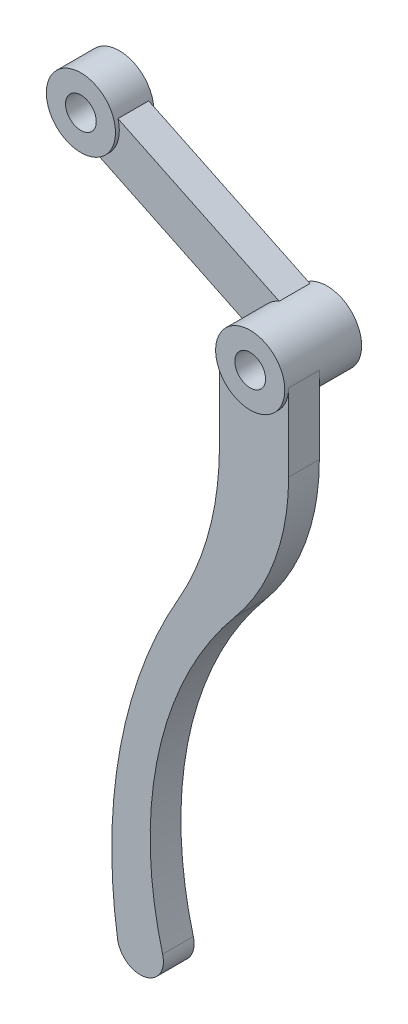
ISO-10303-21;
HEADER;
FILE_DESCRIPTION(('STEP AP214'),'2;1');
FILE_NAME('part.step','',(''),(''),'','','');
FILE_SCHEMA(('AUTOMOTIVE_DESIGN { 1 0 10303 214 1 1 1 1 }'));
ENDSEC;
DATA;
#1=APPLICATION_CONTEXT('core data for automotive mechanical design processes');
#2=APPLICATION_PROTOCOL_DEFINITION('international standard','automotive_design',2000,#1);
#3=PRODUCT_CONTEXT('',#1,'mechanical');
#4=PRODUCT('Part','Part','',(#3));
#5=PRODUCT_RELATED_PRODUCT_CATEGORY('part','',(#4));
#6=PRODUCT_DEFINITION_FORMATION('','',#4);
#7=PRODUCT_DEFINITION_CONTEXT('part definition',#1,'design');
#8=PRODUCT_DEFINITION('design','',#6,#7);
#9=PRODUCT_DEFINITION_SHAPE('','',#8);
#10=(LENGTH_UNIT() NAMED_UNIT(*) SI_UNIT(.MILLI.,.METRE.));
#11=(NAMED_UNIT(*) PLANE_ANGLE_UNIT() SI_UNIT($,.RADIAN.));
#12=(NAMED_UNIT(*) SI_UNIT($,.STERADIAN.) SOLID_ANGLE_UNIT());
#13=UNCERTAINTY_MEASURE_WITH_UNIT(LENGTH_MEASURE(1.E-05),#10,'distance_accuracy_value','');
#14=(GEOMETRIC_REPRESENTATION_CONTEXT(3) GLOBAL_UNCERTAINTY_ASSIGNED_CONTEXT((#13)) GLOBAL_UNIT_ASSIGNED_CONTEXT((#10,
#11,#12)) REPRESENTATION_CONTEXT('',''));
#15=CARTESIAN_POINT('',(0.,0.,0.));
#16=DIRECTION('',(0.,0.,1.));
#17=DIRECTION('',(1.,0.,0.));
#18=AXIS2_PLACEMENT_3D('',#15,#16,#17);
#19=CARTESIAN_POINT('',(0.,0.,10.));
#20=DIRECTION('',(0.,0.,-1.));
#21=DIRECTION('',(-1.,0.,0.));
#22=AXIS2_PLACEMENT_3D('',#19,#20,#21);
#23=CYLINDRICAL_SURFACE('',#22,9.);
#24=DIRECTION('',(0.,0.,-1.));
#25=VECTOR('',#24,1.);
#26=CARTESIAN_POINT('',(-9.,0.,19.));
#27=LINE('',#26,#25);
#28=CARTESIAN_POINT('',(-9.,0.,19.));
#29=VERTEX_POINT('',#28);
#30=CARTESIAN_POINT('',(-9.,0.,11.));
#31=VERTEX_POINT('',#30);
#32=EDGE_CURVE('E54',#29,#31,#27,.T.);
#33=ORIENTED_EDGE('',*,*,#32,.F.);
#34=CARTESIAN_POINT('',(0.,0.,19.));
#35=DIRECTION('',(0.,0.,-1.));
#36=DIRECTION('',(1.,0.,0.));
#37=AXIS2_PLACEMENT_3D('',#34,#35,#36);
#38=CIRCLE('',#37,9.);
#39=CARTESIAN_POINT('',(9.,0.,19.));
#40=VERTEX_POINT('',#39);
#41=EDGE_CURVE('E59',#40,#29,#38,.T.);
#42=ORIENTED_EDGE('',*,*,#41,.F.);
#43=DIRECTION('',(0.,0.,-1.));
#44=VECTOR('',#43,1.);
#45=CARTESIAN_POINT('',(9.,0.,19.));
#46=LINE('',#45,#44);
#47=CARTESIAN_POINT('',(9.,0.,11.));
#48=VERTEX_POINT('',#47);
#49=EDGE_CURVE('E166',#40,#48,#46,.T.);
#50=ORIENTED_EDGE('',*,*,#49,.T.);
#51=CARTESIAN_POINT('',(0.,0.,11.));
#52=DIRECTION('',(0.,0.,-1.));
#53=DIRECTION('',(1.,0.,0.));
#54=AXIS2_PLACEMENT_3D('',#51,#52,#53);
#55=CIRCLE('',#54,9.);
#56=EDGE_CURVE('E167',#48,#31,#55,.T.);
#57=ORIENTED_EDGE('',*,*,#56,.T.);
#58=EDGE_LOOP('',(#33,#42,#50,#57));
#59=FACE_BOUND('',#58,.T.);
#60=CARTESIAN_POINT('',(0.,0.,0.));
#61=DIRECTION('',(0.,0.,1.));
#62=DIRECTION('',(1.,0.,0.));
#63=AXIS2_PLACEMENT_3D('',#60,#61,#62);
#64=CIRCLE('',#63,9.);
#65=CARTESIAN_POINT('',(9.,0.,0.));
#66=VERTEX_POINT('',#65);
#67=EDGE_CURVE('E11',#66,#66,#64,.T.);
#68=ORIENTED_EDGE('',*,*,#67,.T.);
#69=EDGE_LOOP('',(#68));
#70=FACE_BOUND('',#69,.T.);
#71=CARTESIAN_POINT('',(0.,0.,1.));
#72=DIRECTION('',(0.,0.,-1.));
#73=DIRECTION('',(1.,0.,0.));
#74=AXIS2_PLACEMENT_3D('',#71,#72,#73);
#75=CIRCLE('',#74,9.);
#76=CARTESIAN_POINT('',(-8.64550313801937,-2.50105487554696,1.));
#77=VERTEX_POINT('',#76);
#78=CARTESIAN_POINT('',(-3.44617977852671,8.31407510996103,1.));
#79=VERTEX_POINT('',#78);
#80=EDGE_CURVE('E238',#77,#79,#75,.T.);
#81=ORIENTED_EDGE('',*,*,#80,.T.);
#82=DIRECTION('',(0.,0.,1.));
#83=VECTOR('',#82,1.);
#84=CARTESIAN_POINT('',(-3.44617977852671,8.31407510996103,1.));
#85=LINE('',#84,#83);
#86=CARTESIAN_POINT('',(-3.44617977852671,8.31407510996103,9.));
#87=VERTEX_POINT('',#86);
#88=EDGE_CURVE('E254',#79,#87,#85,.T.);
#89=ORIENTED_EDGE('',*,*,#88,.T.);
#90=CARTESIAN_POINT('',(0.,0.,9.));
#91=DIRECTION('',(0.,0.,-1.));
#92=DIRECTION('',(1.,0.,0.));
#93=AXIS2_PLACEMENT_3D('',#90,#91,#92);
#94=CIRCLE('',#93,9.);
#95=CARTESIAN_POINT('',(-8.64550313801937,-2.50105487554696,9.));
#96=VERTEX_POINT('',#95);
#97=EDGE_CURVE('E234',#96,#87,#94,.T.);
#98=ORIENTED_EDGE('',*,*,#97,.F.);
#99=DIRECTION('',(0.,0.,1.));
#100=VECTOR('',#99,1.);
#101=CARTESIAN_POINT('',(-8.64550313801937,-2.50105487554696,1.));
#102=LINE('',#101,#100);
#103=EDGE_CURVE('E268',#77,#96,#102,.T.);
#104=ORIENTED_EDGE('',*,*,#103,.F.);
#105=EDGE_LOOP('',(#81,#89,#98,#104));
#106=FACE_BOUND('',#105,.T.);
#107=CARTESIAN_POINT('',(0.,0.,20.));
#108=DIRECTION('',(0.,0.,1.));
#109=DIRECTION('',(1.,0.,0.));
#110=AXIS2_PLACEMENT_3D('',#107,#108,#109);
#111=CIRCLE('',#110,9.);
#112=CARTESIAN_POINT('',(9.,0.,20.));
#113=VERTEX_POINT('',#112);
#114=EDGE_CURVE('E217',#113,#113,#111,.T.);
#115=ORIENTED_EDGE('',*,*,#114,.F.);
#116=EDGE_LOOP('',(#115));
#117=FACE_BOUND('',#116,.T.);
#118=ADVANCED_FACE('F39',(#59,#70,#106,#117),#23,.T.);
#119=CARTESIAN_POINT('',(0.,0.,0.));
#120=DIRECTION('',(0.,0.,1.));
#121=DIRECTION('',(1.,0.,0.));
#122=AXIS2_PLACEMENT_3D('',#119,#120,#121);
#123=PLANE('',#122);
#124=ORIENTED_EDGE('',*,*,#67,.F.);
#125=EDGE_LOOP('',(#124));
#126=FACE_BOUND('',#125,.T.);
#127=CARTESIAN_POINT('',(0.,0.,0.));
#128=DIRECTION('',(0.,0.,1.));
#129=DIRECTION('',(1.,0.,0.));
#130=AXIS2_PLACEMENT_3D('',#127,#128,#129);
#131=CIRCLE('',#130,4.);
#132=CARTESIAN_POINT('',(4.,0.,0.));
#133=VERTEX_POINT('',#132);
#134=EDGE_CURVE('E47',#133,#133,#131,.T.);
#135=ORIENTED_EDGE('',*,*,#134,.T.);
#136=EDGE_LOOP('',(#135));
#137=FACE_BOUND('',#136,.T.);
#138=ADVANCED_FACE('F285',(#126,#137),#123,.F.);
#139=CARTESIAN_POINT('',(0.,0.,10.));
#140=DIRECTION('',(0.,0.,-1.));
#141=DIRECTION('',(-1.,0.,0.));
#142=AXIS2_PLACEMENT_3D('',#139,#140,#141);
#143=CYLINDRICAL_SURFACE('',#142,4.);
#144=ORIENTED_EDGE('',*,*,#134,.F.);
#145=EDGE_LOOP('',(#144));
#146=FACE_BOUND('',#145,.T.);
#147=CARTESIAN_POINT('',(0.,0.,20.));
#148=DIRECTION('',(0.,0.,1.));
#149=DIRECTION('',(1.,0.,0.));
#150=AXIS2_PLACEMENT_3D('',#147,#148,#149);
#151=CIRCLE('',#150,4.);
#152=CARTESIAN_POINT('',(4.,0.,20.));
#153=VERTEX_POINT('',#152);
#154=EDGE_CURVE('E213',#153,#153,#151,.T.);
#155=ORIENTED_EDGE('',*,*,#154,.T.);
#156=EDGE_LOOP('',(#155));
#157=FACE_BOUND('',#156,.T.);
#158=ADVANCED_FACE('F287',(#146,#157),#143,.F.);
#159=CARTESIAN_POINT('',(-50.6294701490132,17.6825416875023,1.));
#160=DIRECTION('',(-0.433276946624388,-0.901260832125666,0.));
#161=DIRECTION('',(0.901260832125666,-0.433276946624388,0.));
#162=AXIS2_PLACEMENT_3D('',#159,#160,#161);
#163=PLANE('',#162);
#164=DIRECTION('',(0.901260832125665,-0.433276946624388,0.));
#165=VECTOR('',#164,1.);
#166=CARTESIAN_POINT('',(-50.6294701490132,17.6825416875023,9.));
#167=LINE('',#166,#165);
#168=CARTESIAN_POINT('',(-50.6294701490132,17.6825416875023,9.));
#169=VERTEX_POINT('',#168);
#170=EDGE_CURVE('E243',#169,#96,#167,.T.);
#171=ORIENTED_EDGE('',*,*,#170,.F.);
#172=DIRECTION('',(0.,0.,1.));
#173=VECTOR('',#172,1.);
#174=CARTESIAN_POINT('',(-50.6294701490132,17.6825416875023,1.));
#175=LINE('',#174,#173);
#176=CARTESIAN_POINT('',(-50.6294701490132,17.6825416875023,1.));
#177=VERTEX_POINT('',#176);
#178=EDGE_CURVE('E272',#177,#169,#175,.T.);
#179=ORIENTED_EDGE('',*,*,#178,.F.);
#180=DIRECTION('',(0.901260832125665,-0.433276946624388,0.));
#181=VECTOR('',#180,1.);
#182=CARTESIAN_POINT('',(-50.6294701490132,17.6825416875023,1.));
#183=LINE('',#182,#181);
#184=EDGE_CURVE('E250',#177,#77,#183,.T.);
#185=ORIENTED_EDGE('',*,*,#184,.T.);
#186=ORIENTED_EDGE('',*,*,#103,.T.);
#187=EDGE_LOOP('',(#171,#179,#185,#186));
#188=FACE_BOUND('',#187,.T.);
#189=ADVANCED_FACE('F290',(#188),#163,.T.);
#190=CARTESIAN_POINT('',(-45.4301467895205,28.4976716730102,1.));
#191=DIRECTION('',(0.433276946624388,0.901260832125665,0.));
#192=DIRECTION('',(-0.901260832125665,0.433276946624388,0.));
#193=AXIS2_PLACEMENT_3D('',#190,#191,#192);
#194=PLANE('',#193);
#195=DIRECTION('',(-0.901260832125665,0.433276946624388,0.));
#196=VECTOR('',#195,1.);
#197=CARTESIAN_POINT('',(-45.4301467895205,28.4976716730102,9.));
#198=LINE('',#197,#196);
#199=CARTESIAN_POINT('',(-45.4301467895205,28.4976716730102,9.));
#200=VERTEX_POINT('',#199);
#201=EDGE_CURVE('E258',#87,#200,#198,.T.);
#202=ORIENTED_EDGE('',*,*,#201,.F.);
#203=ORIENTED_EDGE('',*,*,#88,.F.);
#204=DIRECTION('',(-0.901260832125665,0.433276946624388,0.));
#205=VECTOR('',#204,1.);
#206=CARTESIAN_POINT('',(-45.4301467895205,28.4976716730102,1.));
#207=LINE('',#206,#205);
#208=CARTESIAN_POINT('',(-45.4301467895205,28.4976716730102,1.));
#209=VERTEX_POINT('',#208);
#210=EDGE_CURVE('E242',#79,#209,#207,.T.);
#211=ORIENTED_EDGE('',*,*,#210,.T.);
#212=DIRECTION('',(0.,0.,1.));
#213=VECTOR('',#212,1.);
#214=CARTESIAN_POINT('',(-45.4301467895205,28.4976716730102,1.));
#215=LINE('',#214,#213);
#216=EDGE_CURVE('E275',#209,#200,#215,.T.);
#217=ORIENTED_EDGE('',*,*,#216,.T.);
#218=EDGE_LOOP('',(#202,#203,#211,#217));
#219=FACE_BOUND('',#218,.T.);
#220=ADVANCED_FACE('F332',(#219),#194,.T.);
#221=CARTESIAN_POINT('',(0.,0.,1.));
#222=DIRECTION('',(0.,0.,1.));
#223=DIRECTION('',(1.,0.,0.));
#224=AXIS2_PLACEMENT_3D('',#221,#222,#223);
#225=PLANE('',#224);
#226=ORIENTED_EDGE('',*,*,#80,.F.);
#227=ORIENTED_EDGE('',*,*,#184,.F.);
#228=CARTESIAN_POINT('',(-54.0756499275399,25.9966167974633,1.));
#229=DIRECTION('',(0.,0.,-1.));
#230=DIRECTION('',(1.,0.,0.));
#231=AXIS2_PLACEMENT_3D('',#228,#229,#230);
#232=CIRCLE('',#231,9.00000000000001);
#233=EDGE_CURVE('E247',#209,#177,#232,.T.);
#234=ORIENTED_EDGE('',*,*,#233,.F.);
#235=ORIENTED_EDGE('',*,*,#210,.F.);
#236=EDGE_LOOP('',(#226,#227,#234,#235));
#237=FACE_BOUND('',#236,.T.);
#238=ADVANCED_FACE('F322',(#237),#225,.F.);
#239=CARTESIAN_POINT('',(0.,0.,9.));
#240=DIRECTION('',(0.,0.,1.));
#241=DIRECTION('',(1.,0.,0.));
#242=AXIS2_PLACEMENT_3D('',#239,#240,#241);
#243=PLANE('',#242);
#244=ORIENTED_EDGE('',*,*,#97,.T.);
#245=ORIENTED_EDGE('',*,*,#201,.T.);
#246=CARTESIAN_POINT('',(-54.0756499275399,25.9966167974633,9.));
#247=DIRECTION('',(0.,0.,-1.));
#248=DIRECTION('',(1.,0.,0.));
#249=AXIS2_PLACEMENT_3D('',#246,#247,#248);
#250=CIRCLE('',#249,9.00000000000001);
#251=EDGE_CURVE('E262',#200,#169,#250,.T.);
#252=ORIENTED_EDGE('',*,*,#251,.T.);
#253=ORIENTED_EDGE('',*,*,#170,.T.);
#254=EDGE_LOOP('',(#244,#245,#252,#253));
#255=FACE_BOUND('',#254,.T.);
#256=ADVANCED_FACE('F330',(#255),#243,.T.);
#257=CARTESIAN_POINT('',(-54.0756499275399,25.9966167974633,10.));
#258=DIRECTION('',(0.,0.,-1.));
#259=DIRECTION('',(-1.,0.,0.));
#260=AXIS2_PLACEMENT_3D('',#257,#258,#259);
#261=CYLINDRICAL_SURFACE('',#260,9.);
#262=CARTESIAN_POINT('',(-54.0756499275399,25.9966167974633,10.));
#263=DIRECTION('',(0.,0.,1.));
#264=DIRECTION('',(1.,0.,0.));
#265=AXIS2_PLACEMENT_3D('',#262,#263,#264);
#266=CIRCLE('',#265,9.);
#267=CARTESIAN_POINT('',(-45.0756499275399,25.9966167974633,10.));
#268=VERTEX_POINT('',#267);
#269=EDGE_CURVE('E230',#268,#268,#266,.T.);
#270=ORIENTED_EDGE('',*,*,#269,.F.);
#271=EDGE_LOOP('',(#270));
#272=FACE_BOUND('',#271,.T.);
#273=CARTESIAN_POINT('',(-54.0756499275399,25.9966167974633,0.));
#274=DIRECTION('',(0.,0.,1.));
#275=DIRECTION('',(1.,0.,0.));
#276=AXIS2_PLACEMENT_3D('',#273,#274,#275);
#277=CIRCLE('',#276,9.);
#278=CARTESIAN_POINT('',(-45.0756499275399,25.9966167974633,0.));
#279=VERTEX_POINT('',#278);
#280=EDGE_CURVE('E226',#279,#279,#277,.T.);
#281=ORIENTED_EDGE('',*,*,#280,.T.);
#282=EDGE_LOOP('',(#281));
#283=FACE_BOUND('',#282,.T.);
#284=ORIENTED_EDGE('',*,*,#216,.F.);
#285=ORIENTED_EDGE('',*,*,#233,.T.);
#286=ORIENTED_EDGE('',*,*,#178,.T.);
#287=ORIENTED_EDGE('',*,*,#251,.F.);
#288=EDGE_LOOP('',(#284,#285,#286,#287));
#289=FACE_BOUND('',#288,.T.);
#290=ADVANCED_FACE('F328',(#272,#283,#289),#261,.T.);
#291=CARTESIAN_POINT('',(-54.0756499275399,25.9966167974633,10.));
#292=DIRECTION('',(0.,0.,1.));
#293=DIRECTION('',(1.,0.,0.));
#294=AXIS2_PLACEMENT_3D('',#291,#292,#293);
#295=PLANE('',#294);
#296=ORIENTED_EDGE('',*,*,#269,.T.);
#297=EDGE_LOOP('',(#296));
#298=FACE_BOUND('',#297,.T.);
#299=CARTESIAN_POINT('',(-54.0756499275399,25.9966167974633,10.));
#300=DIRECTION('',(0.,0.,1.));
#301=DIRECTION('',(1.,0.,0.));
#302=AXIS2_PLACEMENT_3D('',#299,#300,#301);
#303=CIRCLE('',#302,4.);
#304=CARTESIAN_POINT('',(-50.0756499275399,25.9966167974633,10.));
#305=VERTEX_POINT('',#304);
#306=EDGE_CURVE('E222',#305,#305,#303,.T.);
#307=ORIENTED_EDGE('',*,*,#306,.F.);
#308=EDGE_LOOP('',(#307));
#309=FACE_BOUND('',#308,.T.);
#310=ADVANCED_FACE('F346',(#298,#309),#295,.T.);
#311=CARTESIAN_POINT('',(-54.0756499275399,25.9966167974633,0.));
#312=DIRECTION('',(0.,0.,1.));
#313=DIRECTION('',(1.,0.,0.));
#314=AXIS2_PLACEMENT_3D('',#311,#312,#313);
#315=PLANE('',#314);
#316=ORIENTED_EDGE('',*,*,#280,.F.);
#317=EDGE_LOOP('',(#316));
#318=FACE_BOUND('',#317,.T.);
#319=CARTESIAN_POINT('',(-54.0756499275399,25.9966167974633,0.));
#320=DIRECTION('',(0.,0.,1.));
#321=DIRECTION('',(1.,0.,0.));
#322=AXIS2_PLACEMENT_3D('',#319,#320,#321);
#323=CIRCLE('',#322,4.);
#324=CARTESIAN_POINT('',(-50.0756499275399,25.9966167974633,0.));
#325=VERTEX_POINT('',#324);
#326=EDGE_CURVE('E221',#325,#325,#323,.T.);
#327=ORIENTED_EDGE('',*,*,#326,.T.);
#328=EDGE_LOOP('',(#327));
#329=FACE_BOUND('',#328,.T.);
#330=ADVANCED_FACE('F304',(#318,#329),#315,.F.);
#331=CARTESIAN_POINT('',(-54.0756499275399,25.9966167974633,10.));
#332=DIRECTION('',(0.,0.,-1.));
#333=DIRECTION('',(-1.,0.,0.));
#334=AXIS2_PLACEMENT_3D('',#331,#332,#333);
#335=CYLINDRICAL_SURFACE('',#334,4.);
#336=ORIENTED_EDGE('',*,*,#306,.T.);
#337=EDGE_LOOP('',(#336));
#338=FACE_BOUND('',#337,.T.);
#339=ORIENTED_EDGE('',*,*,#326,.F.);
#340=EDGE_LOOP('',(#339));
#341=FACE_BOUND('',#340,.T.);
#342=ADVANCED_FACE('F296',(#338,#341),#335,.F.);
#343=CARTESIAN_POINT('',(0.,0.,20.));
#344=DIRECTION('',(0.,0.,1.));
#345=DIRECTION('',(1.,0.,0.));
#346=AXIS2_PLACEMENT_3D('',#343,#344,#345);
#347=PLANE('',#346);
#348=ORIENTED_EDGE('',*,*,#114,.T.);
#349=EDGE_LOOP('',(#348));
#350=FACE_BOUND('',#349,.T.);
#351=ORIENTED_EDGE('',*,*,#154,.F.);
#352=EDGE_LOOP('',(#351));
#353=FACE_BOUND('',#352,.T.);
#354=ADVANCED_FACE('F294',(#350,#353),#347,.T.);
#355=CARTESIAN_POINT('',(-9.,0.,19.));
#356=DIRECTION('',(1.,0.,0.));
#357=DIRECTION('',(0.,1.,0.));
#358=AXIS2_PLACEMENT_3D('',#355,#356,#357);
#359=PLANE('',#358);
#360=DIRECTION('',(0.,-1.,0.));
#361=VECTOR('',#360,1.);
#362=CARTESIAN_POINT('',(-9.,0.,11.));
#363=LINE('',#362,#361);
#364=CARTESIAN_POINT('',(-9.,-22.,11.));
#365=VERTEX_POINT('',#364);
#366=EDGE_CURVE('E138',#31,#365,#363,.T.);
#367=ORIENTED_EDGE('',*,*,#366,.T.);
#368=DIRECTION('',(0.,0.,-1.));
#369=VECTOR('',#368,1.);
#370=CARTESIAN_POINT('',(-9.,-22.,19.));
#371=LINE('',#370,#369);
#372=CARTESIAN_POINT('',(-9.,-22.,19.));
#373=VERTEX_POINT('',#372);
#374=EDGE_CURVE('E135',#373,#365,#371,.T.);
#375=ORIENTED_EDGE('',*,*,#374,.F.);
#376=DIRECTION('',(0.,-1.,0.));
#377=VECTOR('',#376,1.);
#378=CARTESIAN_POINT('',(-9.,0.,19.));
#379=LINE('',#378,#377);
#380=EDGE_CURVE('E125',#29,#373,#379,.T.);
#381=ORIENTED_EDGE('',*,*,#380,.F.);
#382=ORIENTED_EDGE('',*,*,#32,.T.);
#383=EDGE_LOOP('',(#367,#375,#381,#382));
#384=FACE_BOUND('',#383,.T.);
#385=ADVANCED_FACE('F136',(#384),#359,.F.);
#386=CARTESIAN_POINT('',(-89.,-22.,19.));
#387=DIRECTION('',(0.,0.,-1.));
#388=DIRECTION('',(-1.,0.,0.));
#389=AXIS2_PLACEMENT_3D('',#386,#387,#388);
#390=CYLINDRICAL_SURFACE('',#389,80.);
#391=CARTESIAN_POINT('',(-89.,-22.,11.));
#392=DIRECTION('',(0.,0.,-1.));
#393=DIRECTION('',(-1.,0.,0.));
#394=AXIS2_PLACEMENT_3D('',#391,#392,#393);
#395=CIRCLE('',#394,80.);
#396=CARTESIAN_POINT('',(-19.68061692844,-61.9352367036722,11.));
#397=VERTEX_POINT('',#396);
#398=EDGE_CURVE('E172',#365,#397,#395,.T.);
#399=ORIENTED_EDGE('',*,*,#398,.T.);
#400=DIRECTION('',(0.,0.,-1.));
#401=VECTOR('',#400,1.);
#402=CARTESIAN_POINT('',(-19.68061692844,-61.9352367036722,19.));
#403=LINE('',#402,#401);
#404=CARTESIAN_POINT('',(-19.68061692844,-61.9352367036722,19.));
#405=VERTEX_POINT('',#404);
#406=EDGE_CURVE('E142',#405,#397,#403,.T.);
#407=ORIENTED_EDGE('',*,*,#406,.F.);
#408=CARTESIAN_POINT('',(-89.,-22.,19.));
#409=DIRECTION('',(0.,0.,-1.));
#410=DIRECTION('',(-1.,0.,0.));
#411=AXIS2_PLACEMENT_3D('',#408,#409,#410);
#412=CIRCLE('',#411,80.);
#413=EDGE_CURVE('E129',#373,#405,#412,.T.);
#414=ORIENTED_EDGE('',*,*,#413,.F.);
#415=ORIENTED_EDGE('',*,*,#374,.T.);
#416=EDGE_LOOP('',(#399,#407,#414,#415));
#417=FACE_BOUND('',#416,.T.);
#418=ADVANCED_FACE('F144',(#417),#390,.F.);
#419=CARTESIAN_POINT('',(92.9633805628449,-126.829996347139,19.));
#420=DIRECTION('',(0.,0.,-1.));
#421=DIRECTION('',(-1.,0.,0.));
#422=AXIS2_PLACEMENT_3D('',#419,#420,#421);
#423=CYLINDRICAL_SURFACE('',#422,130.);
#424=CARTESIAN_POINT('',(92.9633805628449,-126.829996347139,11.));
#425=DIRECTION('',(0.,0.,1.));
#426=DIRECTION('',(1.,0.,0.));
#427=AXIS2_PLACEMENT_3D('',#424,#425,#426);
#428=CIRCLE('',#427,130.);
#429=CARTESIAN_POINT('',(-35.5320869407589,-146.550920033171,11.));
#430=VERTEX_POINT('',#429);
#431=EDGE_CURVE('E175',#397,#430,#428,.T.);
#432=ORIENTED_EDGE('',*,*,#431,.T.);
#433=DIRECTION('',(0.,0.,-1.));
#434=VECTOR('',#433,1.);
#435=CARTESIAN_POINT('',(-35.5320869407589,-146.550920033171,19.));
#436=LINE('',#435,#434);
#437=CARTESIAN_POINT('',(-35.5320869407589,-146.550920033171,19.));
#438=VERTEX_POINT('',#437);
#439=EDGE_CURVE('E205',#438,#430,#436,.T.);
#440=ORIENTED_EDGE('',*,*,#439,.F.);
#441=CARTESIAN_POINT('',(92.9633805628449,-126.829996347139,19.));
#442=DIRECTION('',(0.,0.,1.));
#443=DIRECTION('',(1.,0.,0.));
#444=AXIS2_PLACEMENT_3D('',#441,#442,#443);
#445=CIRCLE('',#444,130.);
#446=EDGE_CURVE('E148',#405,#438,#445,.T.);
#447=ORIENTED_EDGE('',*,*,#446,.F.);
#448=ORIENTED_EDGE('',*,*,#406,.T.);
#449=EDGE_LOOP('',(#432,#440,#447,#448));
#450=FACE_BOUND('',#449,.T.);
#451=ADVANCED_FACE('F407',(#450),#423,.T.);
#452=CARTESIAN_POINT('',(-29.601526902131,-145.640723555354,19.));
#453=DIRECTION('',(0.,0.,-1.));
#454=DIRECTION('',(-1.,0.,0.));
#455=AXIS2_PLACEMENT_3D('',#452,#453,#454);
#456=CYLINDRICAL_SURFACE('',#455,5.99999999999999);
#457=CARTESIAN_POINT('',(-29.601526902131,-145.640723555354,11.));
#458=DIRECTION('',(0.,0.,1.));
#459=DIRECTION('',(1.,0.,0.));
#460=AXIS2_PLACEMENT_3D('',#457,#458,#459);
#461=CIRCLE('',#460,5.99999999999999);
#462=CARTESIAN_POINT('',(-23.8059719443966,-144.087809284739,11.));
#463=VERTEX_POINT('',#462);
#464=EDGE_CURVE('E178',#430,#463,#461,.T.);
#465=ORIENTED_EDGE('',*,*,#464,.T.);
#466=DIRECTION('',(0.,0.,-1.));
#467=VECTOR('',#466,1.);
#468=CARTESIAN_POINT('',(-23.8059719443966,-144.087809284739,19.));
#469=LINE('',#468,#467);
#470=CARTESIAN_POINT('',(-23.8059719443966,-144.087809284739,19.));
#471=VERTEX_POINT('',#470);
#472=EDGE_CURVE('E201',#471,#463,#469,.T.);
#473=ORIENTED_EDGE('',*,*,#472,.F.);
#474=CARTESIAN_POINT('',(-29.601526902131,-145.640723555354,19.));
#475=DIRECTION('',(0.,0.,1.));
#476=DIRECTION('',(1.,0.,0.));
#477=AXIS2_PLACEMENT_3D('',#474,#475,#476);
#478=CIRCLE('',#477,5.99999999999999);
#479=EDGE_CURVE('E151',#438,#471,#478,.T.);
#480=ORIENTED_EDGE('',*,*,#479,.F.);
#481=ORIENTED_EDGE('',*,*,#439,.T.);
#482=EDGE_LOOP('',(#465,#473,#480,#481));
#483=FACE_BOUND('',#482,.T.);
#484=ADVANCED_FACE('F416',(#483),#456,.T.);
#485=CARTESIAN_POINT('',(67.956981553065,-119.5,19.));
#486=DIRECTION('',(0.,0.,-1.));
#487=DIRECTION('',(-1.,0.,0.));
#488=AXIS2_PLACEMENT_3D('',#485,#486,#487);
#489=CYLINDRICAL_SURFACE('',#488,95.);
#490=CARTESIAN_POINT('',(67.956981553065,-119.5,11.));
#491=DIRECTION('',(0.,0.,-1.));
#492=DIRECTION('',(-1.,0.,0.));
#493=AXIS2_PLACEMENT_3D('',#490,#491,#492);
#494=CIRCLE('',#493,95.);
#495=CARTESIAN_POINT('',(-4.95213617300708,-58.5963009957049,11.));
#496=VERTEX_POINT('',#495);
#497=EDGE_CURVE('E181',#463,#496,#494,.T.);
#498=ORIENTED_EDGE('',*,*,#497,.T.);
#499=DIRECTION('',(0.,0.,-1.));
#500=VECTOR('',#499,1.);
#501=CARTESIAN_POINT('',(-4.95213617300708,-58.5963009957049,19.));
#502=LINE('',#501,#500);
#503=CARTESIAN_POINT('',(-4.95213617300708,-58.5963009957049,19.));
#504=VERTEX_POINT('',#503);
#505=EDGE_CURVE('E197',#504,#496,#502,.T.);
#506=ORIENTED_EDGE('',*,*,#505,.F.);
#507=CARTESIAN_POINT('',(67.956981553065,-119.5,19.));
#508=DIRECTION('',(0.,0.,-1.));
#509=DIRECTION('',(-1.,0.,0.));
#510=AXIS2_PLACEMENT_3D('',#507,#508,#509);
#511=CIRCLE('',#510,95.);
#512=EDGE_CURVE('E157',#471,#504,#511,.T.);
#513=ORIENTED_EDGE('',*,*,#512,.F.);
#514=ORIENTED_EDGE('',*,*,#472,.T.);
#515=EDGE_LOOP('',(#498,#506,#513,#514));
#516=FACE_BOUND('',#515,.T.);
#517=ADVANCED_FACE('F426',(#516),#489,.F.);
#518=CARTESIAN_POINT('',(-51.,-20.1308068877292,19.));
#519=DIRECTION('',(0.,0.,-1.));
#520=DIRECTION('',(-1.,0.,0.));
#521=AXIS2_PLACEMENT_3D('',#518,#519,#520);
#522=CYLINDRICAL_SURFACE('',#521,60.);
#523=CARTESIAN_POINT('',(-51.,-20.1308068877292,11.));
#524=DIRECTION('',(0.,0.,1.));
#525=DIRECTION('',(1.,0.,0.));
#526=AXIS2_PLACEMENT_3D('',#523,#524,#525);
#527=CIRCLE('',#526,60.);
#528=CARTESIAN_POINT('',(9.,-20.1308068877292,11.));
#529=VERTEX_POINT('',#528);
#530=EDGE_CURVE('E184',#496,#529,#527,.T.);
#531=ORIENTED_EDGE('',*,*,#530,.T.);
#532=DIRECTION('',(0.,0.,-1.));
#533=VECTOR('',#532,1.);
#534=CARTESIAN_POINT('',(9.,-20.1308068877292,19.));
#535=LINE('',#534,#533);
#536=CARTESIAN_POINT('',(9.,-20.1308068877292,19.));
#537=VERTEX_POINT('',#536);
#538=EDGE_CURVE('E193',#537,#529,#535,.T.);
#539=ORIENTED_EDGE('',*,*,#538,.F.);
#540=CARTESIAN_POINT('',(-51.,-20.1308068877292,19.));
#541=DIRECTION('',(0.,0.,1.));
#542=DIRECTION('',(1.,0.,0.));
#543=AXIS2_PLACEMENT_3D('',#540,#541,#542);
#544=CIRCLE('',#543,60.);
#545=EDGE_CURVE('E160',#504,#537,#544,.T.);
#546=ORIENTED_EDGE('',*,*,#545,.F.);
#547=ORIENTED_EDGE('',*,*,#505,.T.);
#548=EDGE_LOOP('',(#531,#539,#546,#547));
#549=FACE_BOUND('',#548,.T.);
#550=ADVANCED_FACE('F436',(#549),#522,.T.);
#551=CARTESIAN_POINT('',(9.,0.,19.));
#552=DIRECTION('',(-1.,0.,0.));
#553=DIRECTION('',(0.,0.,1.));
#554=AXIS2_PLACEMENT_3D('',#551,#552,#553);
#555=PLANE('',#554);
#556=DIRECTION('',(0.,1.,0.));
#557=VECTOR('',#556,1.);
#558=CARTESIAN_POINT('',(9.,0.,11.));
#559=LINE('',#558,#557);
#560=EDGE_CURVE('E187',#529,#48,#559,.T.);
#561=ORIENTED_EDGE('',*,*,#560,.T.);
#562=ORIENTED_EDGE('',*,*,#49,.F.);
#563=DIRECTION('',(0.,1.,0.));
#564=VECTOR('',#563,1.);
#565=CARTESIAN_POINT('',(9.,0.,19.));
#566=LINE('',#565,#564);
#567=EDGE_CURVE('E163',#537,#40,#566,.T.);
#568=ORIENTED_EDGE('',*,*,#567,.F.);
#569=ORIENTED_EDGE('',*,*,#538,.T.);
#570=EDGE_LOOP('',(#561,#562,#568,#569));
#571=FACE_BOUND('',#570,.T.);
#572=ADVANCED_FACE('F446',(#571),#555,.F.);
#573=CARTESIAN_POINT('',(0.,0.,19.));
#574=DIRECTION('',(0.,0.,1.));
#575=DIRECTION('',(1.,0.,0.));
#576=AXIS2_PLACEMENT_3D('',#573,#574,#575);
#577=PLANE('',#576);
#578=ORIENTED_EDGE('',*,*,#41,.T.);
#579=ORIENTED_EDGE('',*,*,#380,.T.);
#580=ORIENTED_EDGE('',*,*,#413,.T.);
#581=ORIENTED_EDGE('',*,*,#446,.T.);
#582=ORIENTED_EDGE('',*,*,#479,.T.);
#583=ORIENTED_EDGE('',*,*,#512,.T.);
#584=ORIENTED_EDGE('',*,*,#545,.T.);
#585=ORIENTED_EDGE('',*,*,#567,.T.);
#586=EDGE_LOOP('',(#578,#579,#580,#581,#582,#583,#584,#585));
#587=FACE_BOUND('',#586,.T.);
#588=ADVANCED_FACE('F127',(#587),#577,.T.);
#589=CARTESIAN_POINT('',(0.,0.,11.));
#590=DIRECTION('',(0.,0.,1.));
#591=DIRECTION('',(1.,0.,0.));
#592=AXIS2_PLACEMENT_3D('',#589,#590,#591);
#593=PLANE('',#592);
#594=ORIENTED_EDGE('',*,*,#56,.F.);
#595=ORIENTED_EDGE('',*,*,#560,.F.);
#596=ORIENTED_EDGE('',*,*,#530,.F.);
#597=ORIENTED_EDGE('',*,*,#497,.F.);
#598=ORIENTED_EDGE('',*,*,#464,.F.);
#599=ORIENTED_EDGE('',*,*,#431,.F.);
#600=ORIENTED_EDGE('',*,*,#398,.F.);
#601=ORIENTED_EDGE('',*,*,#366,.F.);
#602=EDGE_LOOP('',(#594,#595,#596,#597,#598,#599,#600,#601));
#603=FACE_BOUND('',#602,.T.);
#604=ADVANCED_FACE('F465',(#603),#593,.F.);
#605=CLOSED_SHELL('',(#118,#138,#158,#189,#220,#238,#256,#290,#310,#330,#342,#354,#385,#418,
#451,#484,#517,#550,#572,#588,#604));
#606=MANIFOLD_SOLID_BREP('B2',#605);
#607=ADVANCED_BREP_SHAPE_REPRESENTATION('',(#18,#606),#14);
#608=SHAPE_DEFINITION_REPRESENTATION(#9,#607);
ENDSEC;
END-ISO-10303-21;
